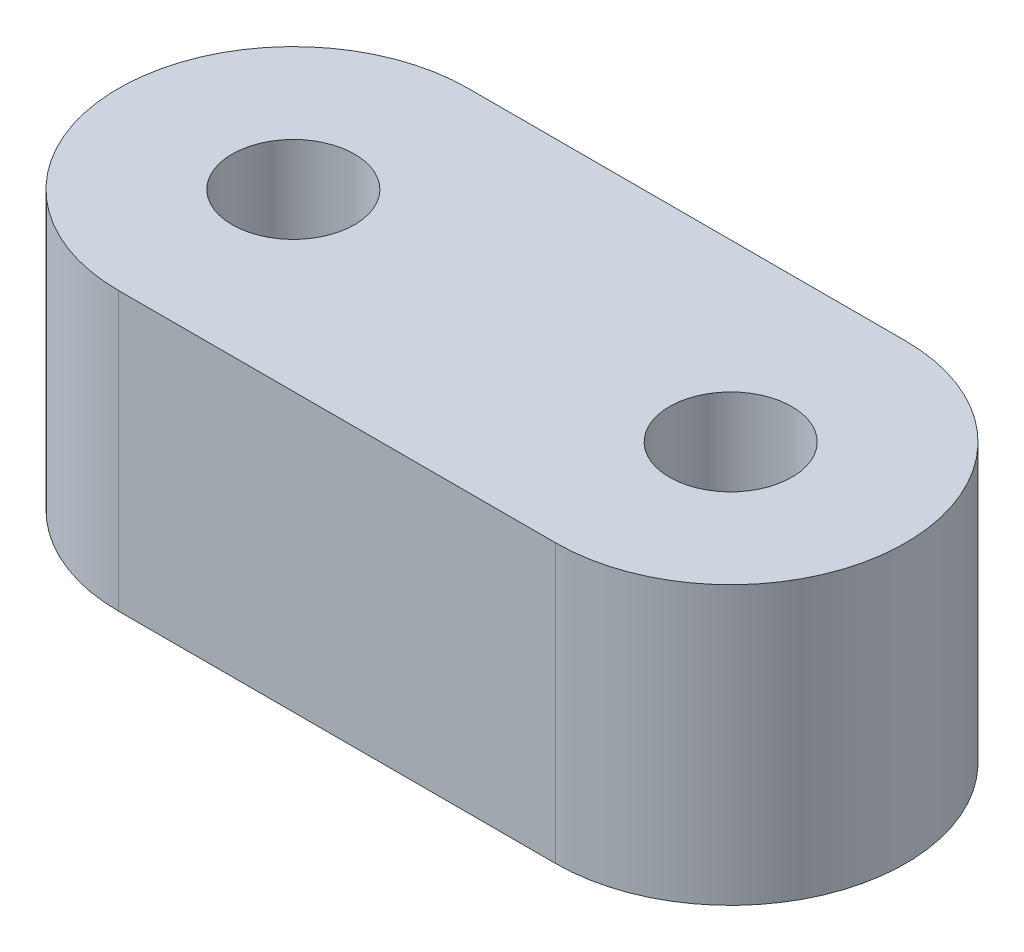
ISO-10303-21;
HEADER;
FILE_DESCRIPTION(('STEP AP214'),'2;1');
FILE_NAME('part.step','',(''),(''),'','','');
FILE_SCHEMA(('AUTOMOTIVE_DESIGN { 1 0 10303 214 1 1 1 1 }'));
ENDSEC;
DATA;
#1=APPLICATION_CONTEXT('core data for automotive mechanical design processes');
#2=APPLICATION_PROTOCOL_DEFINITION('international standard','automotive_design',2000,#1);
#3=PRODUCT_CONTEXT('',#1,'mechanical');
#4=PRODUCT('Part','Part','',(#3));
#5=PRODUCT_RELATED_PRODUCT_CATEGORY('part','',(#4));
#6=PRODUCT_DEFINITION_FORMATION('','',#4);
#7=PRODUCT_DEFINITION_CONTEXT('part definition',#1,'design');
#8=PRODUCT_DEFINITION('design','',#6,#7);
#9=PRODUCT_DEFINITION_SHAPE('','',#8);
#10=(LENGTH_UNIT() NAMED_UNIT(*) SI_UNIT(.MILLI.,.METRE.));
#11=(NAMED_UNIT(*) PLANE_ANGLE_UNIT() SI_UNIT($,.RADIAN.));
#12=(NAMED_UNIT(*) SI_UNIT($,.STERADIAN.) SOLID_ANGLE_UNIT());
#13=UNCERTAINTY_MEASURE_WITH_UNIT(LENGTH_MEASURE(1.E-05),#10,'distance_accuracy_value','');
#14=(GEOMETRIC_REPRESENTATION_CONTEXT(3) GLOBAL_UNCERTAINTY_ASSIGNED_CONTEXT((#13)) GLOBAL_UNIT_ASSIGNED_CONTEXT((#10,
#11,#12)) REPRESENTATION_CONTEXT('',''));
#15=CARTESIAN_POINT('',(0.,0.,0.));
#16=DIRECTION('',(0.,0.,1.));
#17=DIRECTION('',(1.,0.,0.));
#18=AXIS2_PLACEMENT_3D('',#15,#16,#17);
#19=CARTESIAN_POINT('',(5.,6.35,0.));
#20=DIRECTION('',(0.,1.,0.));
#21=DIRECTION('',(0.,0.,1.));
#22=AXIS2_PLACEMENT_3D('',#19,#20,#21);
#23=PLANE('',#22);
#24=CARTESIAN_POINT('',(-5.,6.35,0.));
#25=DIRECTION('',(0.,1.,0.));
#26=DIRECTION('',(0.,0.,1.));
#27=AXIS2_PLACEMENT_3D('',#24,#25,#26);
#28=CIRCLE('',#27,1.4);
#29=CARTESIAN_POINT('',(-5.,6.35,1.4));
#30=VERTEX_POINT('',#29);
#31=EDGE_CURVE('E102',#30,#30,#28,.T.);
#32=ORIENTED_EDGE('',*,*,#31,.F.);
#33=EDGE_LOOP('',(#32));
#34=FACE_BOUND('',#33,.T.);
#35=CARTESIAN_POINT('',(5.,6.35,0.));
#36=DIRECTION('',(0.,1.,0.));
#37=DIRECTION('',(0.,0.,1.));
#38=AXIS2_PLACEMENT_3D('',#35,#36,#37);
#39=CIRCLE('',#38,4.);
#40=CARTESIAN_POINT('',(5.,6.35,4.));
#41=VERTEX_POINT('',#40);
#42=CARTESIAN_POINT('',(5.,6.35,-4.));
#43=VERTEX_POINT('',#42);
#44=EDGE_CURVE('E87',#41,#43,#39,.T.);
#45=ORIENTED_EDGE('',*,*,#44,.T.);
#46=DIRECTION('',(-1.,0.,0.));
#47=VECTOR('',#46,1.);
#48=CARTESIAN_POINT('',(5.,6.35,-4.));
#49=LINE('',#48,#47);
#50=CARTESIAN_POINT('',(-5.,6.35,-4.));
#51=VERTEX_POINT('',#50);
#52=EDGE_CURVE('E82',#43,#51,#49,.T.);
#53=ORIENTED_EDGE('',*,*,#52,.T.);
#54=CARTESIAN_POINT('',(-5.,6.35,0.));
#55=DIRECTION('',(0.,1.,0.));
#56=DIRECTION('',(0.,0.,1.));
#57=AXIS2_PLACEMENT_3D('',#54,#55,#56);
#58=CIRCLE('',#57,4.);
#59=CARTESIAN_POINT('',(-5.,6.35,4.));
#60=VERTEX_POINT('',#59);
#61=EDGE_CURVE('E85',#51,#60,#58,.T.);
#62=ORIENTED_EDGE('',*,*,#61,.T.);
#63=DIRECTION('',(1.,0.,0.));
#64=VECTOR('',#63,1.);
#65=CARTESIAN_POINT('',(5.,6.35,4.));
#66=LINE('',#65,#64);
#67=EDGE_CURVE('E52',#60,#41,#66,.T.);
#68=ORIENTED_EDGE('',*,*,#67,.T.);
#69=EDGE_LOOP('',(#45,#53,#62,#68));
#70=FACE_BOUND('',#69,.T.);
#71=CARTESIAN_POINT('',(5.,6.35,0.));
#72=DIRECTION('',(0.,1.,0.));
#73=DIRECTION('',(0.,0.,1.));
#74=AXIS2_PLACEMENT_3D('',#71,#72,#73);
#75=CIRCLE('',#74,1.4);
#76=CARTESIAN_POINT('',(5.,6.35,1.4));
#77=VERTEX_POINT('',#76);
#78=EDGE_CURVE('E117',#77,#77,#75,.T.);
#79=ORIENTED_EDGE('',*,*,#78,.F.);
#80=EDGE_LOOP('',(#79));
#81=FACE_BOUND('',#80,.T.);
#82=ADVANCED_FACE('F35',(#34,#70,#81),#23,.T.);
#83=CARTESIAN_POINT('',(5.,0.,0.));
#84=DIRECTION('',(0.,1.,0.));
#85=DIRECTION('',(0.,0.,1.));
#86=AXIS2_PLACEMENT_3D('',#83,#84,#85);
#87=PLANE('',#86);
#88=CARTESIAN_POINT('',(-5.,0.,0.));
#89=DIRECTION('',(0.,1.,0.));
#90=DIRECTION('',(0.,0.,1.));
#91=AXIS2_PLACEMENT_3D('',#88,#89,#90);
#92=CIRCLE('',#91,1.4);
#93=CARTESIAN_POINT('',(-5.,0.,1.4));
#94=VERTEX_POINT('',#93);
#95=EDGE_CURVE('E114',#94,#94,#92,.T.);
#96=ORIENTED_EDGE('',*,*,#95,.T.);
#97=EDGE_LOOP('',(#96));
#98=FACE_BOUND('',#97,.T.);
#99=CARTESIAN_POINT('',(5.,0.,0.));
#100=DIRECTION('',(0.,1.,0.));
#101=DIRECTION('',(0.,0.,1.));
#102=AXIS2_PLACEMENT_3D('',#99,#100,#101);
#103=CIRCLE('',#102,4.);
#104=CARTESIAN_POINT('',(5.,0.,4.));
#105=VERTEX_POINT('',#104);
#106=CARTESIAN_POINT('',(5.,0.,-4.));
#107=VERTEX_POINT('',#106);
#108=EDGE_CURVE('E99',#105,#107,#103,.T.);
#109=ORIENTED_EDGE('',*,*,#108,.F.);
#110=DIRECTION('',(1.,0.,0.));
#111=VECTOR('',#110,1.);
#112=CARTESIAN_POINT('',(5.,0.,4.));
#113=LINE('',#112,#111);
#114=CARTESIAN_POINT('',(-5.,0.,4.));
#115=VERTEX_POINT('',#114);
#116=EDGE_CURVE('E75',#115,#105,#113,.T.);
#117=ORIENTED_EDGE('',*,*,#116,.F.);
#118=CARTESIAN_POINT('',(-5.,0.,0.));
#119=DIRECTION('',(0.,1.,0.));
#120=DIRECTION('',(0.,0.,1.));
#121=AXIS2_PLACEMENT_3D('',#118,#119,#120);
#122=CIRCLE('',#121,4.);
#123=CARTESIAN_POINT('',(-5.,0.,-4.));
#124=VERTEX_POINT('',#123);
#125=EDGE_CURVE('E69',#124,#115,#122,.T.);
#126=ORIENTED_EDGE('',*,*,#125,.F.);
#127=DIRECTION('',(-1.,0.,0.));
#128=VECTOR('',#127,1.);
#129=CARTESIAN_POINT('',(5.,0.,-4.));
#130=LINE('',#129,#128);
#131=EDGE_CURVE('E91',#107,#124,#130,.T.);
#132=ORIENTED_EDGE('',*,*,#131,.F.);
#133=EDGE_LOOP('',(#109,#117,#126,#132));
#134=FACE_BOUND('',#133,.T.);
#135=CARTESIAN_POINT('',(5.,0.,0.));
#136=DIRECTION('',(0.,1.,0.));
#137=DIRECTION('',(0.,0.,1.));
#138=AXIS2_PLACEMENT_3D('',#135,#136,#137);
#139=CIRCLE('',#138,1.4);
#140=CARTESIAN_POINT('',(5.,0.,1.4));
#141=VERTEX_POINT('',#140);
#142=EDGE_CURVE('E120',#141,#141,#139,.T.);
#143=ORIENTED_EDGE('',*,*,#142,.T.);
#144=EDGE_LOOP('',(#143));
#145=FACE_BOUND('',#144,.T.);
#146=ADVANCED_FACE('F110',(#98,#134,#145),#87,.F.);
#147=CARTESIAN_POINT('',(5.,6.35,0.));
#148=DIRECTION('',(0.,-1.,0.));
#149=DIRECTION('',(0.,0.,-1.));
#150=AXIS2_PLACEMENT_3D('',#147,#148,#149);
#151=CYLINDRICAL_SURFACE('',#150,4.);
#152=ORIENTED_EDGE('',*,*,#108,.T.);
#153=DIRECTION('',(0.,-1.,0.));
#154=VECTOR('',#153,1.);
#155=CARTESIAN_POINT('',(5.,6.35,-4.));
#156=LINE('',#155,#154);
#157=EDGE_CURVE('E11',#43,#107,#156,.T.);
#158=ORIENTED_EDGE('',*,*,#157,.F.);
#159=ORIENTED_EDGE('',*,*,#44,.F.);
#160=DIRECTION('',(0.,-1.,0.));
#161=VECTOR('',#160,1.);
#162=CARTESIAN_POINT('',(5.,6.35,4.));
#163=LINE('',#162,#161);
#164=EDGE_CURVE('E95',#41,#105,#163,.T.);
#165=ORIENTED_EDGE('',*,*,#164,.T.);
#166=EDGE_LOOP('',(#152,#158,#159,#165));
#167=FACE_BOUND('',#166,.T.);
#168=ADVANCED_FACE('F37',(#167),#151,.T.);
#169=CARTESIAN_POINT('',(5.,6.35,-4.));
#170=DIRECTION('',(0.,0.,1.));
#171=DIRECTION('',(1.,0.,0.));
#172=AXIS2_PLACEMENT_3D('',#169,#170,#171);
#173=PLANE('',#172);
#174=ORIENTED_EDGE('',*,*,#131,.T.);
#175=DIRECTION('',(0.,-1.,0.));
#176=VECTOR('',#175,1.);
#177=CARTESIAN_POINT('',(-5.,6.35,-4.));
#178=LINE('',#177,#176);
#179=EDGE_CURVE('E44',#51,#124,#178,.T.);
#180=ORIENTED_EDGE('',*,*,#179,.F.);
#181=ORIENTED_EDGE('',*,*,#52,.F.);
#182=ORIENTED_EDGE('',*,*,#157,.T.);
#183=EDGE_LOOP('',(#174,#180,#181,#182));
#184=FACE_BOUND('',#183,.T.);
#185=ADVANCED_FACE('F90',(#184),#173,.F.);
#186=CARTESIAN_POINT('',(-5.,6.35,0.));
#187=DIRECTION('',(0.,-1.,0.));
#188=DIRECTION('',(0.,0.,-1.));
#189=AXIS2_PLACEMENT_3D('',#186,#187,#188);
#190=CYLINDRICAL_SURFACE('',#189,4.);
#191=ORIENTED_EDGE('',*,*,#125,.T.);
#192=DIRECTION('',(0.,-1.,0.));
#193=VECTOR('',#192,1.);
#194=CARTESIAN_POINT('',(-5.,6.35,4.));
#195=LINE('',#194,#193);
#196=EDGE_CURVE('E92',#60,#115,#195,.T.);
#197=ORIENTED_EDGE('',*,*,#196,.F.);
#198=ORIENTED_EDGE('',*,*,#61,.F.);
#199=ORIENTED_EDGE('',*,*,#179,.T.);
#200=EDGE_LOOP('',(#191,#197,#198,#199));
#201=FACE_BOUND('',#200,.T.);
#202=ADVANCED_FACE('F93',(#201),#190,.T.);
#203=CARTESIAN_POINT('',(5.,6.35,4.));
#204=DIRECTION('',(0.,0.,-1.));
#205=DIRECTION('',(-1.,0.,0.));
#206=AXIS2_PLACEMENT_3D('',#203,#204,#205);
#207=PLANE('',#206);
#208=ORIENTED_EDGE('',*,*,#116,.T.);
#209=ORIENTED_EDGE('',*,*,#164,.F.);
#210=ORIENTED_EDGE('',*,*,#67,.F.);
#211=ORIENTED_EDGE('',*,*,#196,.T.);
#212=EDGE_LOOP('',(#208,#209,#210,#211));
#213=FACE_BOUND('',#212,.T.);
#214=ADVANCED_FACE('F107',(#213),#207,.F.);
#215=CARTESIAN_POINT('',(-5.,6.35,0.));
#216=DIRECTION('',(0.,-1.,0.));
#217=DIRECTION('',(0.,0.,-1.));
#218=AXIS2_PLACEMENT_3D('',#215,#216,#217);
#219=CYLINDRICAL_SURFACE('',#218,1.4);
#220=ORIENTED_EDGE('',*,*,#31,.T.);
#221=EDGE_LOOP('',(#220));
#222=FACE_BOUND('',#221,.T.);
#223=ORIENTED_EDGE('',*,*,#95,.F.);
#224=EDGE_LOOP('',(#223));
#225=FACE_BOUND('',#224,.T.);
#226=ADVANCED_FACE('F138',(#222,#225),#219,.F.);
#227=CARTESIAN_POINT('',(5.,6.35,0.));
#228=DIRECTION('',(0.,-1.,0.));
#229=DIRECTION('',(0.,0.,-1.));
#230=AXIS2_PLACEMENT_3D('',#227,#228,#229);
#231=CYLINDRICAL_SURFACE('',#230,1.4);
#232=ORIENTED_EDGE('',*,*,#78,.T.);
#233=EDGE_LOOP('',(#232));
#234=FACE_BOUND('',#233,.T.);
#235=ORIENTED_EDGE('',*,*,#142,.F.);
#236=EDGE_LOOP('',(#235));
#237=FACE_BOUND('',#236,.T.);
#238=ADVANCED_FACE('F126',(#234,#237),#231,.F.);
#239=CLOSED_SHELL('',(#82,#146,#168,#185,#202,#214,#226,#238));
#240=MANIFOLD_SOLID_BREP('B2',#239);
#241=ADVANCED_BREP_SHAPE_REPRESENTATION('',(#18,#240),#14);
#242=SHAPE_DEFINITION_REPRESENTATION(#9,#241);
ENDSEC;
END-ISO-10303-21;
